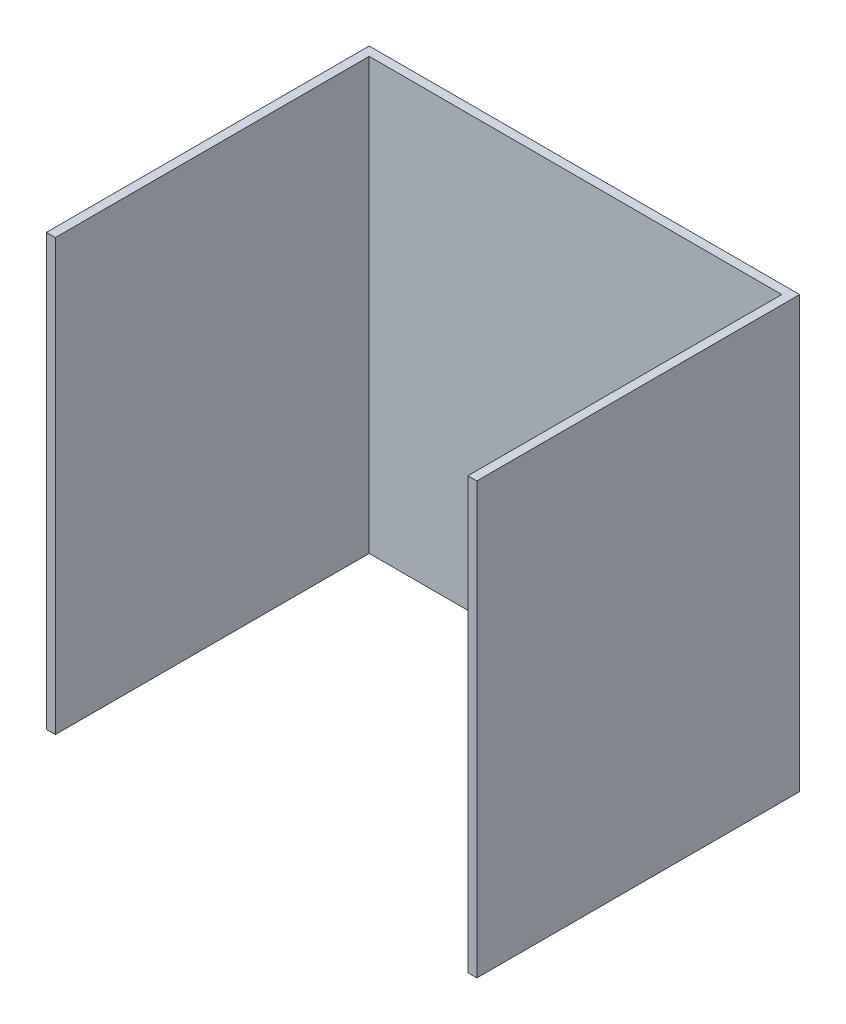
ISO-10303-21;
HEADER;
FILE_DESCRIPTION(('STEP AP214'),'2;1');
FILE_NAME('part.step','',(''),(''),'','','');
FILE_SCHEMA(('AUTOMOTIVE_DESIGN { 1 0 10303 214 1 1 1 1 }'));
ENDSEC;
DATA;
#1=APPLICATION_CONTEXT('core data for automotive mechanical design processes');
#2=APPLICATION_PROTOCOL_DEFINITION('international standard','automotive_design',2000,#1);
#3=PRODUCT_CONTEXT('',#1,'mechanical');
#4=PRODUCT('Part','Part','',(#3));
#5=PRODUCT_RELATED_PRODUCT_CATEGORY('part','',(#4));
#6=PRODUCT_DEFINITION_FORMATION('','',#4);
#7=PRODUCT_DEFINITION_CONTEXT('part definition',#1,'design');
#8=PRODUCT_DEFINITION('design','',#6,#7);
#9=PRODUCT_DEFINITION_SHAPE('','',#8);
#10=(LENGTH_UNIT() NAMED_UNIT(*) SI_UNIT(.MILLI.,.METRE.));
#11=(NAMED_UNIT(*) PLANE_ANGLE_UNIT() SI_UNIT($,.RADIAN.));
#12=(NAMED_UNIT(*) SI_UNIT($,.STERADIAN.) SOLID_ANGLE_UNIT());
#13=UNCERTAINTY_MEASURE_WITH_UNIT(LENGTH_MEASURE(1.E-05),#10,'distance_accuracy_value','');
#14=(GEOMETRIC_REPRESENTATION_CONTEXT(3) GLOBAL_UNCERTAINTY_ASSIGNED_CONTEXT((#13)) GLOBAL_UNIT_ASSIGNED_CONTEXT((#10,
#11,#12)) REPRESENTATION_CONTEXT('',''));
#15=CARTESIAN_POINT('',(0.,0.,0.));
#16=DIRECTION('',(0.,0.,1.));
#17=DIRECTION('',(1.,0.,0.));
#18=AXIS2_PLACEMENT_3D('',#15,#16,#17);
#19=CARTESIAN_POINT('',(0.,609.6,0.));
#20=DIRECTION('',(0.,0.,-1.));
#21=DIRECTION('',(-1.,0.,0.));
#22=AXIS2_PLACEMENT_3D('',#19,#20,#21);
#23=PLANE('',#22);
#24=DIRECTION('',(0.,-1.,0.));
#25=VECTOR('',#24,1.);
#26=CARTESIAN_POINT('',(12.7,609.6,0.));
#27=LINE('',#26,#25);
#28=CARTESIAN_POINT('',(12.7,609.6,0.));
#29=VERTEX_POINT('',#28);
#30=CARTESIAN_POINT('',(12.7,0.,0.));
#31=VERTEX_POINT('',#30);
#32=EDGE_CURVE('E127',#29,#31,#27,.T.);
#33=ORIENTED_EDGE('',*,*,#32,.F.);
#34=DIRECTION('',(1.,0.,0.));
#35=VECTOR('',#34,1.);
#36=CARTESIAN_POINT('',(0.,609.6,0.));
#37=LINE('',#36,#35);
#38=CARTESIAN_POINT('',(0.,609.6,0.));
#39=VERTEX_POINT('',#38);
#40=EDGE_CURVE('E92',#39,#29,#37,.T.);
#41=ORIENTED_EDGE('',*,*,#40,.F.);
#42=DIRECTION('',(0.,-1.,0.));
#43=VECTOR('',#42,1.);
#44=CARTESIAN_POINT('',(0.,609.6,0.));
#45=LINE('',#44,#43);
#46=CARTESIAN_POINT('',(0.,0.,0.));
#47=VERTEX_POINT('',#46);
#48=EDGE_CURVE('E11',#39,#47,#45,.T.);
#49=ORIENTED_EDGE('',*,*,#48,.T.);
#50=DIRECTION('',(1.,0.,0.));
#51=VECTOR('',#50,1.);
#52=CARTESIAN_POINT('',(0.,0.,0.));
#53=LINE('',#52,#51);
#54=EDGE_CURVE('E173',#47,#31,#53,.T.);
#55=ORIENTED_EDGE('',*,*,#54,.T.);
#56=EDGE_LOOP('',(#33,#41,#49,#55));
#57=FACE_BOUND('',#56,.T.);
#58=ADVANCED_FACE('F39',(#57),#23,.F.);
#59=CARTESIAN_POINT('',(0.,609.6,0.));
#60=DIRECTION('',(0.,-1.,0.));
#61=DIRECTION('',(0.,0.,-1.));
#62=AXIS2_PLACEMENT_3D('',#59,#60,#61);
#63=PLANE('',#62);
#64=DIRECTION('',(0.,0.,1.));
#65=VECTOR('',#64,1.);
#66=CARTESIAN_POINT('',(12.7,609.6,0.));
#67=LINE('',#66,#65);
#68=CARTESIAN_POINT('',(12.6999999999998,609.6,-444.5));
#69=VERTEX_POINT('',#68);
#70=EDGE_CURVE('E137',#69,#29,#67,.T.);
#71=ORIENTED_EDGE('',*,*,#70,.F.);
#72=DIRECTION('',(-1.,0.,0.));
#73=VECTOR('',#72,1.);
#74=CARTESIAN_POINT('',(0.,609.6,-444.5));
#75=LINE('',#74,#73);
#76=CARTESIAN_POINT('',(596.9,609.6,-444.5));
#77=VERTEX_POINT('',#76);
#78=EDGE_CURVE('E118',#77,#69,#75,.T.);
#79=ORIENTED_EDGE('',*,*,#78,.F.);
#80=DIRECTION('',(0.,0.,-1.));
#81=VECTOR('',#80,1.);
#82=CARTESIAN_POINT('',(596.9,609.6,-2.89891567541013E-13));
#83=LINE('',#82,#81);
#84=CARTESIAN_POINT('',(596.9,609.6,0.));
#85=VERTEX_POINT('',#84);
#86=EDGE_CURVE('E141',#85,#77,#83,.T.);
#87=ORIENTED_EDGE('',*,*,#86,.F.);
#88=CARTESIAN_POINT('',(609.6,609.6,0.));
#89=VERTEX_POINT('',#88);
#90=EDGE_CURVE('E160',#85,#89,#37,.T.);
#91=ORIENTED_EDGE('',*,*,#90,.T.);
#92=DIRECTION('',(0.,0.,-1.));
#93=VECTOR('',#92,1.);
#94=CARTESIAN_POINT('',(609.6,609.6,0.));
#95=LINE('',#94,#93);
#96=CARTESIAN_POINT('',(609.6,609.6,-457.2));
#97=VERTEX_POINT('',#96);
#98=EDGE_CURVE('E163',#89,#97,#95,.T.);
#99=ORIENTED_EDGE('',*,*,#98,.T.);
#100=DIRECTION('',(-1.,0.,0.));
#101=VECTOR('',#100,1.);
#102=CARTESIAN_POINT('',(-2.22044604925031E-13,609.6,-457.2));
#103=LINE('',#102,#101);
#104=CARTESIAN_POINT('',(-2.22044604925031E-13,609.6,-457.2));
#105=VERTEX_POINT('',#104);
#106=EDGE_CURVE('E64',#97,#105,#103,.T.);
#107=ORIENTED_EDGE('',*,*,#106,.T.);
#108=DIRECTION('',(0.,0.,1.));
#109=VECTOR('',#108,1.);
#110=CARTESIAN_POINT('',(0.,609.6,0.));
#111=LINE('',#110,#109);
#112=EDGE_CURVE('E157',#105,#39,#111,.T.);
#113=ORIENTED_EDGE('',*,*,#112,.T.);
#114=ORIENTED_EDGE('',*,*,#40,.T.);
#115=EDGE_LOOP('',(#71,#79,#87,#91,#99,#107,#113,#114));
#116=FACE_BOUND('',#115,.T.);
#117=ADVANCED_FACE('F212',(#116),#63,.F.);
#118=CARTESIAN_POINT('',(0.,0.,0.));
#119=DIRECTION('',(0.,-1.,0.));
#120=DIRECTION('',(0.,0.,-1.));
#121=AXIS2_PLACEMENT_3D('',#118,#119,#120);
#122=PLANE('',#121);
#123=DIRECTION('',(-1.,0.,0.));
#124=VECTOR('',#123,1.);
#125=CARTESIAN_POINT('',(0.,0.,-444.5));
#126=LINE('',#125,#124);
#127=CARTESIAN_POINT('',(596.9,0.,-444.5));
#128=VERTEX_POINT('',#127);
#129=CARTESIAN_POINT('',(12.6999999999998,0.,-444.5));
#130=VERTEX_POINT('',#129);
#131=EDGE_CURVE('E55',#128,#130,#126,.T.);
#132=ORIENTED_EDGE('',*,*,#131,.T.);
#133=DIRECTION('',(0.,0.,1.));
#134=VECTOR('',#133,1.);
#135=CARTESIAN_POINT('',(12.7,0.,0.));
#136=LINE('',#135,#134);
#137=EDGE_CURVE('E125',#130,#31,#136,.T.);
#138=ORIENTED_EDGE('',*,*,#137,.T.);
#139=ORIENTED_EDGE('',*,*,#54,.F.);
#140=DIRECTION('',(0.,0.,1.));
#141=VECTOR('',#140,1.);
#142=CARTESIAN_POINT('',(0.,0.,0.));
#143=LINE('',#142,#141);
#144=CARTESIAN_POINT('',(-2.22044604925031E-13,0.,-457.2));
#145=VERTEX_POINT('',#144);
#146=EDGE_CURVE('E156',#145,#47,#143,.T.);
#147=ORIENTED_EDGE('',*,*,#146,.F.);
#148=DIRECTION('',(-1.,0.,0.));
#149=VECTOR('',#148,1.);
#150=CARTESIAN_POINT('',(-2.22044604925031E-13,0.,-457.2));
#151=LINE('',#150,#149);
#152=CARTESIAN_POINT('',(609.6,0.,-457.2));
#153=VERTEX_POINT('',#152);
#154=EDGE_CURVE('E85',#153,#145,#151,.T.);
#155=ORIENTED_EDGE('',*,*,#154,.F.);
#156=DIRECTION('',(0.,0.,-1.));
#157=VECTOR('',#156,1.);
#158=CARTESIAN_POINT('',(609.6,0.,0.));
#159=LINE('',#158,#157);
#160=CARTESIAN_POINT('',(609.6,0.,0.));
#161=VERTEX_POINT('',#160);
#162=EDGE_CURVE('E176',#161,#153,#159,.T.);
#163=ORIENTED_EDGE('',*,*,#162,.F.);
#164=CARTESIAN_POINT('',(596.9,0.,0.));
#165=VERTEX_POINT('',#164);
#166=EDGE_CURVE('E172',#165,#161,#53,.T.);
#167=ORIENTED_EDGE('',*,*,#166,.F.);
#168=DIRECTION('',(0.,0.,-1.));
#169=VECTOR('',#168,1.);
#170=CARTESIAN_POINT('',(596.9,0.,-2.89891567541013E-13));
#171=LINE('',#170,#169);
#172=EDGE_CURVE('E131',#165,#128,#171,.T.);
#173=ORIENTED_EDGE('',*,*,#172,.T.);
#174=EDGE_LOOP('',(#132,#138,#139,#147,#155,#163,#167,#173));
#175=FACE_BOUND('',#174,.T.);
#176=ADVANCED_FACE('F134',(#175),#122,.T.);
#177=CARTESIAN_POINT('',(0.,609.6,0.));
#178=DIRECTION('',(1.,0.,0.));
#179=DIRECTION('',(0.,0.,-1.));
#180=AXIS2_PLACEMENT_3D('',#177,#178,#179);
#181=PLANE('',#180);
#182=ORIENTED_EDGE('',*,*,#146,.T.);
#183=ORIENTED_EDGE('',*,*,#48,.F.);
#184=ORIENTED_EDGE('',*,*,#112,.F.);
#185=DIRECTION('',(0.,-1.,0.));
#186=VECTOR('',#185,1.);
#187=CARTESIAN_POINT('',(-2.22044604925031E-13,609.6,-457.2));
#188=LINE('',#187,#186);
#189=EDGE_CURVE('E168',#105,#145,#188,.T.);
#190=ORIENTED_EDGE('',*,*,#189,.T.);
#191=EDGE_LOOP('',(#182,#183,#184,#190));
#192=FACE_BOUND('',#191,.T.);
#193=ADVANCED_FACE('F41',(#192),#181,.F.);
#194=ORIENTED_EDGE('',*,*,#90,.F.);
#195=DIRECTION('',(0.,-1.,0.));
#196=VECTOR('',#195,1.);
#197=CARTESIAN_POINT('',(596.9,609.6,0.));
#198=LINE('',#197,#196);
#199=EDGE_CURVE('E146',#85,#165,#198,.T.);
#200=ORIENTED_EDGE('',*,*,#199,.T.);
#201=ORIENTED_EDGE('',*,*,#166,.T.);
#202=DIRECTION('',(0.,-1.,0.));
#203=VECTOR('',#202,1.);
#204=CARTESIAN_POINT('',(609.6,609.6,0.));
#205=LINE('',#204,#203);
#206=EDGE_CURVE('E48',#89,#161,#205,.T.);
#207=ORIENTED_EDGE('',*,*,#206,.F.);
#208=EDGE_LOOP('',(#194,#200,#201,#207));
#209=FACE_BOUND('',#208,.T.);
#210=ADVANCED_FACE('F208',(#209),#23,.F.);
#211=CARTESIAN_POINT('',(609.6,609.6,0.));
#212=DIRECTION('',(-1.,0.,0.));
#213=DIRECTION('',(0.,0.,1.));
#214=AXIS2_PLACEMENT_3D('',#211,#212,#213);
#215=PLANE('',#214);
#216=ORIENTED_EDGE('',*,*,#162,.T.);
#217=DIRECTION('',(0.,-1.,0.));
#218=VECTOR('',#217,1.);
#219=CARTESIAN_POINT('',(609.6,609.6,-457.2));
#220=LINE('',#219,#218);
#221=EDGE_CURVE('E183',#97,#153,#220,.T.);
#222=ORIENTED_EDGE('',*,*,#221,.F.);
#223=ORIENTED_EDGE('',*,*,#98,.F.);
#224=ORIENTED_EDGE('',*,*,#206,.T.);
#225=EDGE_LOOP('',(#216,#222,#223,#224));
#226=FACE_BOUND('',#225,.T.);
#227=ADVANCED_FACE('F191',(#226),#215,.F.);
#228=CARTESIAN_POINT('',(-2.22044604925031E-13,609.6,-457.2));
#229=DIRECTION('',(0.,0.,1.));
#230=DIRECTION('',(1.,0.,0.));
#231=AXIS2_PLACEMENT_3D('',#228,#229,#230);
#232=PLANE('',#231);
#233=ORIENTED_EDGE('',*,*,#154,.T.);
#234=ORIENTED_EDGE('',*,*,#189,.F.);
#235=ORIENTED_EDGE('',*,*,#106,.F.);
#236=ORIENTED_EDGE('',*,*,#221,.T.);
#237=EDGE_LOOP('',(#233,#234,#235,#236));
#238=FACE_BOUND('',#237,.T.);
#239=ADVANCED_FACE('F199',(#238),#232,.F.);
#240=CARTESIAN_POINT('',(12.7,609.6,0.));
#241=DIRECTION('',(1.,0.,0.));
#242=DIRECTION('',(0.,0.,-1.));
#243=AXIS2_PLACEMENT_3D('',#240,#241,#242);
#244=PLANE('',#243);
#245=ORIENTED_EDGE('',*,*,#137,.F.);
#246=DIRECTION('',(0.,-1.,0.));
#247=VECTOR('',#246,1.);
#248=CARTESIAN_POINT('',(12.6999999999998,609.6,-444.5));
#249=LINE('',#248,#247);
#250=EDGE_CURVE('E114',#69,#130,#249,.T.);
#251=ORIENTED_EDGE('',*,*,#250,.F.);
#252=ORIENTED_EDGE('',*,*,#70,.T.);
#253=ORIENTED_EDGE('',*,*,#32,.T.);
#254=EDGE_LOOP('',(#245,#251,#252,#253));
#255=FACE_BOUND('',#254,.T.);
#256=ADVANCED_FACE('F126',(#255),#244,.T.);
#257=CARTESIAN_POINT('',(596.9,609.6,0.));
#258=DIRECTION('',(-1.,0.,0.));
#259=DIRECTION('',(0.,0.,1.));
#260=AXIS2_PLACEMENT_3D('',#257,#258,#259);
#261=PLANE('',#260);
#262=ORIENTED_EDGE('',*,*,#172,.F.);
#263=ORIENTED_EDGE('',*,*,#199,.F.);
#264=ORIENTED_EDGE('',*,*,#86,.T.);
#265=DIRECTION('',(0.,-1.,0.));
#266=VECTOR('',#265,1.);
#267=CARTESIAN_POINT('',(596.9,609.6,-444.5));
#268=LINE('',#267,#266);
#269=EDGE_CURVE('E122',#77,#128,#268,.T.);
#270=ORIENTED_EDGE('',*,*,#269,.T.);
#271=EDGE_LOOP('',(#262,#263,#264,#270));
#272=FACE_BOUND('',#271,.T.);
#273=ADVANCED_FACE('F206',(#272),#261,.T.);
#274=CARTESIAN_POINT('',(-2.22044604925031E-13,609.6,-444.5));
#275=DIRECTION('',(0.,0.,1.));
#276=DIRECTION('',(1.,0.,0.));
#277=AXIS2_PLACEMENT_3D('',#274,#275,#276);
#278=PLANE('',#277);
#279=ORIENTED_EDGE('',*,*,#131,.F.);
#280=ORIENTED_EDGE('',*,*,#269,.F.);
#281=ORIENTED_EDGE('',*,*,#78,.T.);
#282=ORIENTED_EDGE('',*,*,#250,.T.);
#283=EDGE_LOOP('',(#279,#280,#281,#282));
#284=FACE_BOUND('',#283,.T.);
#285=ADVANCED_FACE('F116',(#284),#278,.T.);
#286=CLOSED_SHELL('',(#58,#117,#176,#193,#210,#227,#239,#256,#273,#285));
#287=MANIFOLD_SOLID_BREP('B2',#286);
#288=ADVANCED_BREP_SHAPE_REPRESENTATION('',(#18,#287),#14);
#289=SHAPE_DEFINITION_REPRESENTATION(#9,#288);
ENDSEC;
END-ISO-10303-21;
